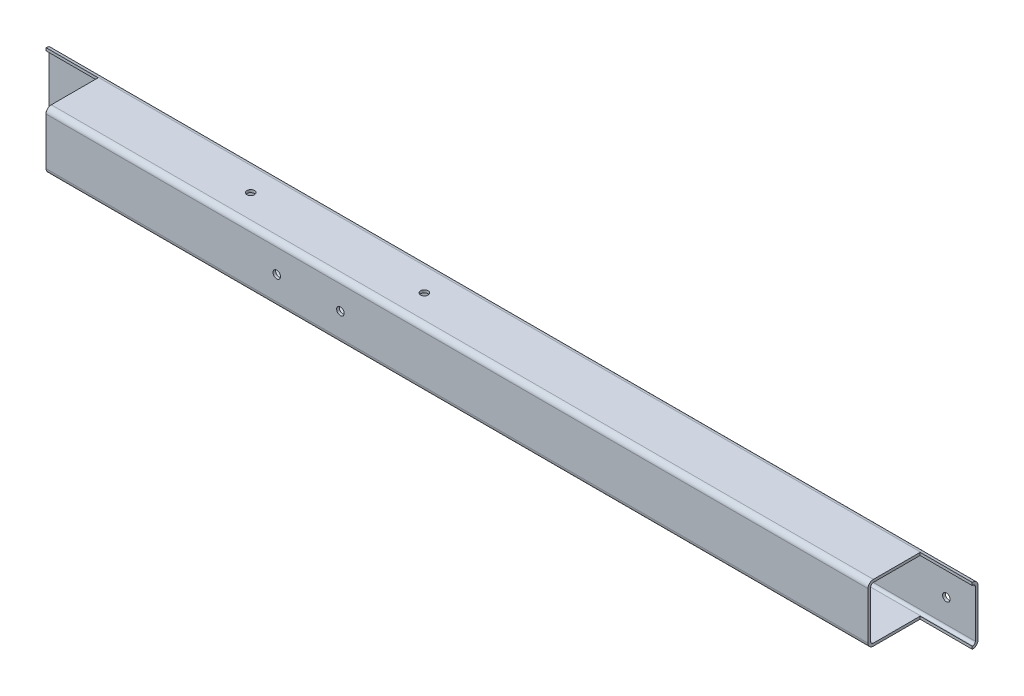
ISO-10303-21;
HEADER;
FILE_DESCRIPTION(('STEP AP214'),'2;1');
FILE_NAME('part.step','',(''),(''),'','','');
FILE_SCHEMA(('AUTOMOTIVE_DESIGN { 1 0 10303 214 1 1 1 1 }'));
ENDSEC;
DATA;
#1=APPLICATION_CONTEXT('core data for automotive mechanical design processes');
#2=APPLICATION_PROTOCOL_DEFINITION('international standard','automotive_design',2000,#1);
#3=PRODUCT_CONTEXT('',#1,'mechanical');
#4=PRODUCT('Part','Part','',(#3));
#5=PRODUCT_RELATED_PRODUCT_CATEGORY('part','',(#4));
#6=PRODUCT_DEFINITION_FORMATION('','',#4);
#7=PRODUCT_DEFINITION_CONTEXT('part definition',#1,'design');
#8=PRODUCT_DEFINITION('design','',#6,#7);
#9=PRODUCT_DEFINITION_SHAPE('','',#8);
#10=(LENGTH_UNIT() NAMED_UNIT(*) SI_UNIT(.MILLI.,.METRE.));
#11=(NAMED_UNIT(*) PLANE_ANGLE_UNIT() SI_UNIT($,.RADIAN.));
#12=(NAMED_UNIT(*) SI_UNIT($,.STERADIAN.) SOLID_ANGLE_UNIT());
#13=UNCERTAINTY_MEASURE_WITH_UNIT(LENGTH_MEASURE(1.E-05),#10,'distance_accuracy_value','');
#14=(GEOMETRIC_REPRESENTATION_CONTEXT(3) GLOBAL_UNCERTAINTY_ASSIGNED_CONTEXT((#13)) GLOBAL_UNIT_ASSIGNED_CONTEXT((#10,
#11,#12)) REPRESENTATION_CONTEXT('',''));
#15=CARTESIAN_POINT('',(0.,0.,0.));
#16=DIRECTION('',(0.,0.,1.));
#17=DIRECTION('',(1.,0.,0.));
#18=AXIS2_PLACEMENT_3D('',#15,#16,#17);
#19=CARTESIAN_POINT('',(400.,-20.3999999999999,20.4));
#20=DIRECTION('',(-1.,0.,0.));
#21=DIRECTION('',(0.,-1.,0.));
#22=AXIS2_PLACEMENT_3D('',#19,#20,#21);
#23=CYLINDRICAL_SURFACE('',#22,2.3);
#24=CARTESIAN_POINT('',(-355.,-20.4,20.4));
#25=DIRECTION('',(1.,0.,0.));
#26=DIRECTION('',(0.,0.,-1.));
#27=AXIS2_PLACEMENT_3D('',#24,#25,#26);
#28=CIRCLE('',#27,2.3);
#29=CARTESIAN_POINT('',(-355.,-20.3999999999999,22.7));
#30=VERTEX_POINT('',#29);
#31=CARTESIAN_POINT('',(-355.,-22.7,20.4));
#32=VERTEX_POINT('',#31);
#33=EDGE_CURVE('E332',#30,#32,#28,.T.);
#34=ORIENTED_EDGE('',*,*,#33,.F.);
#35=DIRECTION('',(-1.,0.,0.));
#36=VECTOR('',#35,1.);
#37=CARTESIAN_POINT('',(400.,-20.3999999999999,22.7));
#38=LINE('',#37,#36);
#39=CARTESIAN_POINT('',(355.,-20.3999999999999,22.7));
#40=VERTEX_POINT('',#39);
#41=EDGE_CURVE('E444',#40,#30,#38,.T.);
#42=ORIENTED_EDGE('',*,*,#41,.F.);
#43=CARTESIAN_POINT('',(355.,-20.3999999999999,20.4));
#44=DIRECTION('',(-1.,0.,0.));
#45=DIRECTION('',(0.,0.,1.));
#46=AXIS2_PLACEMENT_3D('',#43,#44,#45);
#47=CIRCLE('',#46,2.3);
#48=CARTESIAN_POINT('',(355.,-22.6999999999999,20.4));
#49=VERTEX_POINT('',#48);
#50=EDGE_CURVE('E312',#49,#40,#47,.T.);
#51=ORIENTED_EDGE('',*,*,#50,.F.);
#52=DIRECTION('',(-1.,0.,0.));
#53=VECTOR('',#52,1.);
#54=CARTESIAN_POINT('',(400.,-22.6999999999999,20.4));
#55=LINE('',#54,#53);
#56=EDGE_CURVE('E418',#49,#32,#55,.T.);
#57=ORIENTED_EDGE('',*,*,#56,.T.);
#58=EDGE_LOOP('',(#34,#42,#51,#57));
#59=FACE_BOUND('',#58,.T.);
#60=ADVANCED_FACE('F65',(#59),#23,.F.);
#61=CARTESIAN_POINT('',(400.,-20.3999999999999,22.7));
#62=DIRECTION('',(0.,0.,-1.));
#63=DIRECTION('',(-1.,0.,0.));
#64=AXIS2_PLACEMENT_3D('',#61,#62,#63);
#65=PLANE('',#64);
#66=CARTESIAN_POINT('',(-155.7,0.,22.7));
#67=DIRECTION('',(0.,0.,-1.));
#68=DIRECTION('',(-1.,0.,0.));
#69=AXIS2_PLACEMENT_3D('',#66,#67,#68);
#70=CIRCLE('',#69,3.25000000000001);
#71=CARTESIAN_POINT('',(-158.95,0.,22.7));
#72=VERTEX_POINT('',#71);
#73=EDGE_CURVE('E544',#72,#72,#70,.T.);
#74=ORIENTED_EDGE('',*,*,#73,.F.);
#75=EDGE_LOOP('',(#74));
#76=FACE_BOUND('',#75,.T.);
#77=CARTESIAN_POINT('',(-100.7,0.,22.7));
#78=DIRECTION('',(0.,0.,-1.));
#79=DIRECTION('',(-1.,0.,0.));
#80=AXIS2_PLACEMENT_3D('',#77,#78,#79);
#81=CIRCLE('',#80,3.25000000000001);
#82=CARTESIAN_POINT('',(-103.95,0.,22.7));
#83=VERTEX_POINT('',#82);
#84=EDGE_CURVE('E536',#83,#83,#81,.T.);
#85=ORIENTED_EDGE('',*,*,#84,.F.);
#86=EDGE_LOOP('',(#85));
#87=FACE_BOUND('',#86,.T.);
#88=DIRECTION('',(0.,-1.,0.));
#89=VECTOR('',#88,1.);
#90=CARTESIAN_POINT('',(-355.,-20.3999999999999,22.7));
#91=LINE('',#90,#89);
#92=CARTESIAN_POINT('',(-355.,20.4000000000001,22.7));
#93=VERTEX_POINT('',#92);
#94=EDGE_CURVE('E335',#93,#30,#91,.T.);
#95=ORIENTED_EDGE('',*,*,#94,.F.);
#96=DIRECTION('',(-1.,0.,0.));
#97=VECTOR('',#96,1.);
#98=CARTESIAN_POINT('',(400.,20.4000000000001,22.7));
#99=LINE('',#98,#97);
#100=CARTESIAN_POINT('',(355.,20.4000000000001,22.7));
#101=VERTEX_POINT('',#100);
#102=EDGE_CURVE('E440',#101,#93,#99,.T.);
#103=ORIENTED_EDGE('',*,*,#102,.F.);
#104=DIRECTION('',(0.,1.,0.));
#105=VECTOR('',#104,1.);
#106=CARTESIAN_POINT('',(355.,-20.3999999999999,22.7));
#107=LINE('',#106,#105);
#108=EDGE_CURVE('E315',#40,#101,#107,.T.);
#109=ORIENTED_EDGE('',*,*,#108,.F.);
#110=ORIENTED_EDGE('',*,*,#41,.T.);
#111=EDGE_LOOP('',(#95,#103,#109,#110));
#112=FACE_BOUND('',#111,.T.);
#113=ADVANCED_FACE('F604',(#76,#87,#112),#65,.T.);
#114=CARTESIAN_POINT('',(400.,20.4000000000001,20.4));
#115=DIRECTION('',(-1.,0.,0.));
#116=DIRECTION('',(0.,-1.,0.));
#117=AXIS2_PLACEMENT_3D('',#114,#115,#116);
#118=CYLINDRICAL_SURFACE('',#117,2.3);
#119=CARTESIAN_POINT('',(-355.,20.4,20.4));
#120=DIRECTION('',(1.,0.,0.));
#121=DIRECTION('',(0.,0.,-1.));
#122=AXIS2_PLACEMENT_3D('',#119,#120,#121);
#123=CIRCLE('',#122,2.3);
#124=CARTESIAN_POINT('',(-355.,22.7,20.4));
#125=VERTEX_POINT('',#124);
#126=EDGE_CURVE('E338',#125,#93,#123,.T.);
#127=ORIENTED_EDGE('',*,*,#126,.F.);
#128=DIRECTION('',(-1.,0.,0.));
#129=VECTOR('',#128,1.);
#130=CARTESIAN_POINT('',(400.,22.7000000000001,20.4));
#131=LINE('',#130,#129);
#132=CARTESIAN_POINT('',(355.,22.7000000000001,20.4));
#133=VERTEX_POINT('',#132);
#134=EDGE_CURVE('E436',#133,#125,#131,.T.);
#135=ORIENTED_EDGE('',*,*,#134,.F.);
#136=CARTESIAN_POINT('',(355.,20.4000000000001,20.4));
#137=DIRECTION('',(-1.,0.,0.));
#138=DIRECTION('',(0.,0.,1.));
#139=AXIS2_PLACEMENT_3D('',#136,#137,#138);
#140=CIRCLE('',#139,2.3);
#141=EDGE_CURVE('E318',#101,#133,#140,.T.);
#142=ORIENTED_EDGE('',*,*,#141,.F.);
#143=ORIENTED_EDGE('',*,*,#102,.T.);
#144=EDGE_LOOP('',(#127,#135,#142,#143));
#145=FACE_BOUND('',#144,.T.);
#146=ADVANCED_FACE('F599',(#145),#118,.F.);
#147=CARTESIAN_POINT('',(400.,22.7000000000001,-20.4));
#148=DIRECTION('',(0.,-1.,0.));
#149=DIRECTION('',(1.,0.,0.));
#150=AXIS2_PLACEMENT_3D('',#147,#148,#149);
#151=PLANE('',#150);
#152=CARTESIAN_POINT('',(-203.2,22.7,0.));
#153=DIRECTION('',(0.,-1.,0.));
#154=DIRECTION('',(1.,0.,0.));
#155=AXIS2_PLACEMENT_3D('',#152,#153,#154);
#156=CIRCLE('',#155,3.25000000000001);
#157=CARTESIAN_POINT('',(-199.95,22.7,0.));
#158=VERTEX_POINT('',#157);
#159=EDGE_CURVE('E512',#158,#158,#156,.T.);
#160=ORIENTED_EDGE('',*,*,#159,.F.);
#161=EDGE_LOOP('',(#160));
#162=FACE_BOUND('',#161,.T.);
#163=CARTESIAN_POINT('',(-53.2,22.7000000000001,0.));
#164=DIRECTION('',(0.,-1.,0.));
#165=DIRECTION('',(1.,0.,0.));
#166=AXIS2_PLACEMENT_3D('',#163,#164,#165);
#167=CIRCLE('',#166,3.25);
#168=CARTESIAN_POINT('',(-49.95,22.7000000000001,0.));
#169=VERTEX_POINT('',#168);
#170=EDGE_CURVE('E487',#169,#169,#167,.T.);
#171=ORIENTED_EDGE('',*,*,#170,.F.);
#172=EDGE_LOOP('',(#171));
#173=FACE_BOUND('',#172,.T.);
#174=DIRECTION('',(1.,0.,0.));
#175=VECTOR('',#174,1.);
#176=CARTESIAN_POINT('',(400.,22.7000000000001,-20.));
#177=LINE('',#176,#175);
#178=CARTESIAN_POINT('',(-400.,22.7,-20.));
#179=VERTEX_POINT('',#178);
#180=CARTESIAN_POINT('',(-355.,22.7,-20.));
#181=VERTEX_POINT('',#180);
#182=EDGE_CURVE('E235',#179,#181,#177,.T.);
#183=ORIENTED_EDGE('',*,*,#182,.F.);
#184=DIRECTION('',(0.,0.,1.));
#185=VECTOR('',#184,1.);
#186=CARTESIAN_POINT('',(-400.,22.7,-20.4));
#187=LINE('',#186,#185);
#188=CARTESIAN_POINT('',(-400.,22.7,-20.4));
#189=VERTEX_POINT('',#188);
#190=EDGE_CURVE('E400',#189,#179,#187,.T.);
#191=ORIENTED_EDGE('',*,*,#190,.F.);
#192=DIRECTION('',(-1.,0.,0.));
#193=VECTOR('',#192,1.);
#194=CARTESIAN_POINT('',(400.,22.7000000000001,-20.4));
#195=LINE('',#194,#193);
#196=CARTESIAN_POINT('',(400.,22.7000000000001,-20.4));
#197=VERTEX_POINT('',#196);
#198=EDGE_CURVE('E433',#197,#189,#195,.T.);
#199=ORIENTED_EDGE('',*,*,#198,.F.);
#200=DIRECTION('',(0.,0.,1.));
#201=VECTOR('',#200,1.);
#202=CARTESIAN_POINT('',(400.,22.7000000000001,-20.4));
#203=LINE('',#202,#201);
#204=CARTESIAN_POINT('',(400.,22.7000000000001,-20.));
#205=VERTEX_POINT('',#204);
#206=EDGE_CURVE('E367',#197,#205,#203,.T.);
#207=ORIENTED_EDGE('',*,*,#206,.T.);
#208=DIRECTION('',(1.,0.,0.));
#209=VECTOR('',#208,1.);
#210=CARTESIAN_POINT('',(400.,22.7000000000001,-20.));
#211=LINE('',#210,#209);
#212=CARTESIAN_POINT('',(355.,22.7000000000001,-20.));
#213=VERTEX_POINT('',#212);
#214=EDGE_CURVE('E309',#213,#205,#211,.T.);
#215=ORIENTED_EDGE('',*,*,#214,.F.);
#216=DIRECTION('',(0.,0.,-1.));
#217=VECTOR('',#216,1.);
#218=CARTESIAN_POINT('',(355.,22.7000000000001,-20.4));
#219=LINE('',#218,#217);
#220=EDGE_CURVE('E321',#133,#213,#219,.T.);
#221=ORIENTED_EDGE('',*,*,#220,.F.);
#222=ORIENTED_EDGE('',*,*,#134,.T.);
#223=DIRECTION('',(0.,0.,1.));
#224=VECTOR('',#223,1.);
#225=CARTESIAN_POINT('',(-355.,22.7,-20.4));
#226=LINE('',#225,#224);
#227=EDGE_CURVE('E341',#181,#125,#226,.T.);
#228=ORIENTED_EDGE('',*,*,#227,.F.);
#229=EDGE_LOOP('',(#183,#191,#199,#207,#215,#221,#222,#228));
#230=FACE_BOUND('',#229,.T.);
#231=ADVANCED_FACE('F593',(#162,#173,#230),#151,.T.);
#232=CARTESIAN_POINT('',(400.,20.4000000000001,-20.4));
#233=DIRECTION('',(-1.,0.,0.));
#234=DIRECTION('',(0.,-1.,0.));
#235=AXIS2_PLACEMENT_3D('',#232,#233,#234);
#236=CYLINDRICAL_SURFACE('',#235,2.3);
#237=CARTESIAN_POINT('',(-400.,20.4,-20.4));
#238=DIRECTION('',(1.,0.,0.));
#239=DIRECTION('',(0.,1.,0.));
#240=AXIS2_PLACEMENT_3D('',#237,#238,#239);
#241=CIRCLE('',#240,2.3);
#242=CARTESIAN_POINT('',(-400.,20.4,-22.7));
#243=VERTEX_POINT('',#242);
#244=EDGE_CURVE('E404',#243,#189,#241,.T.);
#245=ORIENTED_EDGE('',*,*,#244,.F.);
#246=DIRECTION('',(-1.,0.,0.));
#247=VECTOR('',#246,1.);
#248=CARTESIAN_POINT('',(400.,20.4000000000001,-22.7));
#249=LINE('',#248,#247);
#250=CARTESIAN_POINT('',(400.,20.4000000000001,-22.7));
#251=VERTEX_POINT('',#250);
#252=EDGE_CURVE('E430',#251,#243,#249,.T.);
#253=ORIENTED_EDGE('',*,*,#252,.F.);
#254=CARTESIAN_POINT('',(400.,20.4000000000001,-20.4));
#255=DIRECTION('',(1.,0.,0.));
#256=DIRECTION('',(0.,1.,0.));
#257=AXIS2_PLACEMENT_3D('',#254,#255,#256);
#258=CIRCLE('',#257,2.3);
#259=EDGE_CURVE('E371',#251,#197,#258,.T.);
#260=ORIENTED_EDGE('',*,*,#259,.T.);
#261=ORIENTED_EDGE('',*,*,#198,.T.);
#262=EDGE_LOOP('',(#245,#253,#260,#261));
#263=FACE_BOUND('',#262,.T.);
#264=ADVANCED_FACE('F570',(#263),#236,.F.);
#265=CARTESIAN_POINT('',(400.,-20.3999999999999,-22.7));
#266=DIRECTION('',(0.,0.,1.));
#267=DIRECTION('',(1.,0.,0.));
#268=AXIS2_PLACEMENT_3D('',#265,#266,#267);
#269=PLANE('',#268);
#270=CARTESIAN_POINT('',(-155.7,0.,-22.7));
#271=DIRECTION('',(0.,0.,1.));
#272=DIRECTION('',(1.,0.,0.));
#273=AXIS2_PLACEMENT_3D('',#270,#271,#272);
#274=CIRCLE('',#273,3.25000000000001);
#275=CARTESIAN_POINT('',(-152.45,0.,-22.7));
#276=VERTEX_POINT('',#275);
#277=EDGE_CURVE('E540',#276,#276,#274,.T.);
#278=ORIENTED_EDGE('',*,*,#277,.F.);
#279=EDGE_LOOP('',(#278));
#280=FACE_BOUND('',#279,.T.);
#281=CARTESIAN_POINT('',(-100.7,0.,-22.7));
#282=DIRECTION('',(0.,0.,1.));
#283=DIRECTION('',(1.,0.,0.));
#284=AXIS2_PLACEMENT_3D('',#281,#282,#283);
#285=CIRCLE('',#284,3.25000000000001);
#286=CARTESIAN_POINT('',(-97.45,0.,-22.7));
#287=VERTEX_POINT('',#286);
#288=EDGE_CURVE('E521',#287,#287,#285,.T.);
#289=ORIENTED_EDGE('',*,*,#288,.F.);
#290=EDGE_LOOP('',(#289));
#291=FACE_BOUND('',#290,.T.);
#292=CARTESIAN_POINT('',(375.,0.,-22.7));
#293=DIRECTION('',(0.,0.,1.));
#294=DIRECTION('',(1.,0.,0.));
#295=AXIS2_PLACEMENT_3D('',#292,#293,#294);
#296=CIRCLE('',#295,3.24999999999995);
#297=CARTESIAN_POINT('',(378.25,0.,-22.7));
#298=VERTEX_POINT('',#297);
#299=EDGE_CURVE('E283',#298,#298,#296,.T.);
#300=ORIENTED_EDGE('',*,*,#299,.F.);
#301=EDGE_LOOP('',(#300));
#302=FACE_BOUND('',#301,.T.);
#303=CARTESIAN_POINT('',(-375.,1.37772764904077E-13,-22.7));
#304=DIRECTION('',(0.,0.,1.));
#305=DIRECTION('',(1.,0.,0.));
#306=AXIS2_PLACEMENT_3D('',#303,#304,#305);
#307=CIRCLE('',#306,3.24999999999995);
#308=CARTESIAN_POINT('',(-371.75,1.37772764904077E-13,-22.7));
#309=VERTEX_POINT('',#308);
#310=EDGE_CURVE('E553',#309,#309,#307,.T.);
#311=ORIENTED_EDGE('',*,*,#310,.F.);
#312=EDGE_LOOP('',(#311));
#313=FACE_BOUND('',#312,.T.);
#314=DIRECTION('',(0.,1.,0.));
#315=VECTOR('',#314,1.);
#316=CARTESIAN_POINT('',(-400.,-20.4,-22.7));
#317=LINE('',#316,#315);
#318=CARTESIAN_POINT('',(-400.,-20.4,-22.7));
#319=VERTEX_POINT('',#318);
#320=EDGE_CURVE('E408',#319,#243,#317,.T.);
#321=ORIENTED_EDGE('',*,*,#320,.F.);
#322=DIRECTION('',(-1.,0.,0.));
#323=VECTOR('',#322,1.);
#324=CARTESIAN_POINT('',(400.,-20.3999999999999,-22.7));
#325=LINE('',#324,#323);
#326=CARTESIAN_POINT('',(400.,-20.3999999999999,-22.7));
#327=VERTEX_POINT('',#326);
#328=EDGE_CURVE('E427',#327,#319,#325,.T.);
#329=ORIENTED_EDGE('',*,*,#328,.F.);
#330=DIRECTION('',(0.,1.,0.));
#331=VECTOR('',#330,1.);
#332=CARTESIAN_POINT('',(400.,-20.3999999999999,-22.7));
#333=LINE('',#332,#331);
#334=EDGE_CURVE('E375',#327,#251,#333,.T.);
#335=ORIENTED_EDGE('',*,*,#334,.T.);
#336=ORIENTED_EDGE('',*,*,#252,.T.);
#337=EDGE_LOOP('',(#321,#329,#335,#336));
#338=FACE_BOUND('',#337,.T.);
#339=ADVANCED_FACE('F566',(#280,#291,#302,#313,#338),#269,.T.);
#340=CARTESIAN_POINT('',(400.,-20.3999999999999,-20.4));
#341=DIRECTION('',(-1.,0.,0.));
#342=DIRECTION('',(0.,-1.,0.));
#343=AXIS2_PLACEMENT_3D('',#340,#341,#342);
#344=CYLINDRICAL_SURFACE('',#343,2.3);
#345=CARTESIAN_POINT('',(-400.,-20.4,-20.4));
#346=DIRECTION('',(1.,0.,0.));
#347=DIRECTION('',(0.,-1.,0.));
#348=AXIS2_PLACEMENT_3D('',#345,#346,#347);
#349=CIRCLE('',#348,2.3);
#350=CARTESIAN_POINT('',(-400.,-22.7,-20.4));
#351=VERTEX_POINT('',#350);
#352=EDGE_CURVE('E412',#351,#319,#349,.T.);
#353=ORIENTED_EDGE('',*,*,#352,.F.);
#354=DIRECTION('',(-1.,0.,0.));
#355=VECTOR('',#354,1.);
#356=CARTESIAN_POINT('',(400.,-22.6999999999999,-20.4));
#357=LINE('',#356,#355);
#358=CARTESIAN_POINT('',(400.,-22.6999999999999,-20.4));
#359=VERTEX_POINT('',#358);
#360=EDGE_CURVE('E422',#359,#351,#357,.T.);
#361=ORIENTED_EDGE('',*,*,#360,.F.);
#362=CARTESIAN_POINT('',(400.,-20.3999999999999,-20.4));
#363=DIRECTION('',(1.,0.,0.));
#364=DIRECTION('',(0.,-1.,0.));
#365=AXIS2_PLACEMENT_3D('',#362,#363,#364);
#366=CIRCLE('',#365,2.3);
#367=EDGE_CURVE('E379',#359,#327,#366,.T.);
#368=ORIENTED_EDGE('',*,*,#367,.T.);
#369=ORIENTED_EDGE('',*,*,#328,.T.);
#370=EDGE_LOOP('',(#353,#361,#368,#369));
#371=FACE_BOUND('',#370,.T.);
#372=ADVANCED_FACE('F569',(#371),#344,.F.);
#373=CARTESIAN_POINT('',(400.,-20.3999999999999,20.4));
#374=DIRECTION('',(-1.,0.,0.));
#375=DIRECTION('',(0.,-1.,0.));
#376=AXIS2_PLACEMENT_3D('',#373,#374,#375);
#377=CYLINDRICAL_SURFACE('',#376,4.6);
#378=DIRECTION('',(-1.,0.,0.));
#379=VECTOR('',#378,1.);
#380=CARTESIAN_POINT('',(400.,-20.3999999999999,25.));
#381=LINE('',#380,#379);
#382=CARTESIAN_POINT('',(355.,-20.4,25.));
#383=VERTEX_POINT('',#382);
#384=CARTESIAN_POINT('',(-355.,-20.4,25.));
#385=VERTEX_POINT('',#384);
#386=EDGE_CURVE('E386',#383,#385,#381,.T.);
#387=ORIENTED_EDGE('',*,*,#386,.T.);
#388=CARTESIAN_POINT('',(-355.,-20.4,20.4));
#389=DIRECTION('',(1.,0.,0.));
#390=DIRECTION('',(0.,0.,-1.));
#391=AXIS2_PLACEMENT_3D('',#388,#389,#390);
#392=CIRCLE('',#391,4.6);
#393=CARTESIAN_POINT('',(-355.,-25.,20.4));
#394=VERTEX_POINT('',#393);
#395=EDGE_CURVE('E346',#385,#394,#392,.T.);
#396=ORIENTED_EDGE('',*,*,#395,.T.);
#397=DIRECTION('',(-1.,0.,0.));
#398=VECTOR('',#397,1.);
#399=CARTESIAN_POINT('',(400.,-24.9999999999999,20.4));
#400=LINE('',#399,#398);
#401=CARTESIAN_POINT('',(355.,-25.,20.4));
#402=VERTEX_POINT('',#401);
#403=EDGE_CURVE('E423',#402,#394,#400,.T.);
#404=ORIENTED_EDGE('',*,*,#403,.F.);
#405=CARTESIAN_POINT('',(355.,-20.3999999999999,20.4));
#406=DIRECTION('',(-1.,0.,0.));
#407=DIRECTION('',(0.,0.,1.));
#408=AXIS2_PLACEMENT_3D('',#405,#406,#407);
#409=CIRCLE('',#408,4.6);
#410=EDGE_CURVE('E328',#402,#383,#409,.T.);
#411=ORIENTED_EDGE('',*,*,#410,.T.);
#412=EDGE_LOOP('',(#387,#396,#404,#411));
#413=FACE_BOUND('',#412,.T.);
#414=ADVANCED_FACE('F67',(#413),#377,.T.);
#415=CARTESIAN_POINT('',(400.,-24.9999999999999,-20.4));
#416=DIRECTION('',(0.,1.,0.));
#417=DIRECTION('',(-1.,0.,0.));
#418=AXIS2_PLACEMENT_3D('',#415,#416,#417);
#419=PLANE('',#418);
#420=CARTESIAN_POINT('',(-203.2,-25.0000000000001,0.));
#421=DIRECTION('',(0.,1.,0.));
#422=DIRECTION('',(-1.,0.,0.));
#423=AXIS2_PLACEMENT_3D('',#420,#421,#422);
#424=CIRCLE('',#423,3.25000000000001);
#425=CARTESIAN_POINT('',(-206.45,-25.0000000000001,0.));
#426=VERTEX_POINT('',#425);
#427=EDGE_CURVE('E488',#426,#426,#424,.T.);
#428=ORIENTED_EDGE('',*,*,#427,.T.);
#429=EDGE_LOOP('',(#428));
#430=FACE_BOUND('',#429,.T.);
#431=CARTESIAN_POINT('',(-53.2,-25.0000000000001,0.));
#432=DIRECTION('',(0.,1.,0.));
#433=DIRECTION('',(-1.,0.,0.));
#434=AXIS2_PLACEMENT_3D('',#431,#432,#433);
#435=CIRCLE('',#434,3.25);
#436=CARTESIAN_POINT('',(-56.45,-25.0000000000001,0.));
#437=VERTEX_POINT('',#436);
#438=EDGE_CURVE('E502',#437,#437,#435,.T.);
#439=ORIENTED_EDGE('',*,*,#438,.T.);
#440=EDGE_LOOP('',(#439));
#441=FACE_BOUND('',#440,.T.);
#442=DIRECTION('',(0.,0.,-1.));
#443=VECTOR('',#442,1.);
#444=CARTESIAN_POINT('',(-355.,-25.,25.));
#445=LINE('',#444,#443);
#446=CARTESIAN_POINT('',(-355.,-25.,-20.));
#447=VERTEX_POINT('',#446);
#448=EDGE_CURVE('E259',#394,#447,#445,.T.);
#449=ORIENTED_EDGE('',*,*,#448,.T.);
#450=DIRECTION('',(-1.,0.,0.));
#451=VECTOR('',#450,1.);
#452=CARTESIAN_POINT('',(-400.,-25.,-20.));
#453=LINE('',#452,#451);
#454=CARTESIAN_POINT('',(-400.,-25.,-20.));
#455=VERTEX_POINT('',#454);
#456=EDGE_CURVE('E265',#447,#455,#453,.T.);
#457=ORIENTED_EDGE('',*,*,#456,.T.);
#458=DIRECTION('',(0.,0.,-1.));
#459=VECTOR('',#458,1.);
#460=CARTESIAN_POINT('',(-400.,-25.,-20.4));
#461=LINE('',#460,#459);
#462=CARTESIAN_POINT('',(-400.,-25.,-20.4));
#463=VERTEX_POINT('',#462);
#464=EDGE_CURVE('E350',#455,#463,#461,.T.);
#465=ORIENTED_EDGE('',*,*,#464,.T.);
#466=DIRECTION('',(-1.,0.,0.));
#467=VECTOR('',#466,1.);
#468=CARTESIAN_POINT('',(400.,-24.9999999999999,-20.4));
#469=LINE('',#468,#467);
#470=CARTESIAN_POINT('',(400.,-24.9999999999999,-20.4));
#471=VERTEX_POINT('',#470);
#472=EDGE_CURVE('E470',#471,#463,#469,.T.);
#473=ORIENTED_EDGE('',*,*,#472,.F.);
#474=DIRECTION('',(0.,0.,-1.));
#475=VECTOR('',#474,1.);
#476=CARTESIAN_POINT('',(400.,-24.9999999999999,-20.4));
#477=LINE('',#476,#475);
#478=CARTESIAN_POINT('',(400.,-24.9999999999999,-20.));
#479=VERTEX_POINT('',#478);
#480=EDGE_CURVE('E351',#479,#471,#477,.T.);
#481=ORIENTED_EDGE('',*,*,#480,.F.);
#482=DIRECTION('',(-1.,0.,0.));
#483=VECTOR('',#482,1.);
#484=CARTESIAN_POINT('',(400.,-25.,-20.));
#485=LINE('',#484,#483);
#486=CARTESIAN_POINT('',(355.,-25.,-20.));
#487=VERTEX_POINT('',#486);
#488=EDGE_CURVE('E83',#479,#487,#485,.T.);
#489=ORIENTED_EDGE('',*,*,#488,.T.);
#490=DIRECTION('',(0.,0.,1.));
#491=VECTOR('',#490,1.);
#492=CARTESIAN_POINT('',(355.,-25.,25.));
#493=LINE('',#492,#491);
#494=EDGE_CURVE('E288',#487,#402,#493,.T.);
#495=ORIENTED_EDGE('',*,*,#494,.T.);
#496=ORIENTED_EDGE('',*,*,#403,.T.);
#497=EDGE_LOOP('',(#449,#457,#465,#473,#481,#489,#495,#496));
#498=FACE_BOUND('',#497,.T.);
#499=ADVANCED_FACE('F619',(#430,#441,#498),#419,.F.);
#500=CARTESIAN_POINT('',(400.,-20.3999999999999,-20.4));
#501=DIRECTION('',(-1.,0.,0.));
#502=DIRECTION('',(0.,-1.,0.));
#503=AXIS2_PLACEMENT_3D('',#500,#501,#502);
#504=CYLINDRICAL_SURFACE('',#503,4.6);
#505=CARTESIAN_POINT('',(-400.,-20.4,-20.4));
#506=DIRECTION('',(1.,0.,0.));
#507=DIRECTION('',(0.,-1.,0.));
#508=AXIS2_PLACEMENT_3D('',#505,#506,#507);
#509=CIRCLE('',#508,4.6);
#510=CARTESIAN_POINT('',(-400.,-20.4,-25.));
#511=VERTEX_POINT('',#510);
#512=EDGE_CURVE('E389',#463,#511,#509,.T.);
#513=ORIENTED_EDGE('',*,*,#512,.T.);
#514=DIRECTION('',(-1.,0.,0.));
#515=VECTOR('',#514,1.);
#516=CARTESIAN_POINT('',(400.,-20.3999999999999,-25.));
#517=LINE('',#516,#515);
#518=CARTESIAN_POINT('',(400.,-20.3999999999999,-25.));
#519=VERTEX_POINT('',#518);
#520=EDGE_CURVE('E466',#519,#511,#517,.T.);
#521=ORIENTED_EDGE('',*,*,#520,.F.);
#522=CARTESIAN_POINT('',(400.,-20.3999999999999,-20.4));
#523=DIRECTION('',(1.,0.,0.));
#524=DIRECTION('',(0.,-1.,0.));
#525=AXIS2_PLACEMENT_3D('',#522,#523,#524);
#526=CIRCLE('',#525,4.6);
#527=EDGE_CURVE('E353',#471,#519,#526,.T.);
#528=ORIENTED_EDGE('',*,*,#527,.F.);
#529=ORIENTED_EDGE('',*,*,#472,.T.);
#530=EDGE_LOOP('',(#513,#521,#528,#529));
#531=FACE_BOUND('',#530,.T.);
#532=ADVANCED_FACE('F654',(#531),#504,.T.);
#533=CARTESIAN_POINT('',(400.,-20.3999999999999,-25.));
#534=DIRECTION('',(0.,0.,1.));
#535=DIRECTION('',(1.,0.,0.));
#536=AXIS2_PLACEMENT_3D('',#533,#534,#535);
#537=PLANE('',#536);
#538=CARTESIAN_POINT('',(-155.7,0.,-25.));
#539=DIRECTION('',(0.,0.,1.));
#540=DIRECTION('',(1.,0.,0.));
#541=AXIS2_PLACEMENT_3D('',#538,#539,#540);
#542=CIRCLE('',#541,3.25000000000001);
#543=CARTESIAN_POINT('',(-152.45,0.,-25.));
#544=VERTEX_POINT('',#543);
#545=EDGE_CURVE('E517',#544,#544,#542,.T.);
#546=ORIENTED_EDGE('',*,*,#545,.T.);
#547=EDGE_LOOP('',(#546));
#548=FACE_BOUND('',#547,.T.);
#549=CARTESIAN_POINT('',(-100.7,0.,-25.));
#550=DIRECTION('',(0.,0.,1.));
#551=DIRECTION('',(1.,0.,0.));
#552=AXIS2_PLACEMENT_3D('',#549,#550,#551);
#553=CIRCLE('',#552,3.25000000000001);
#554=CARTESIAN_POINT('',(-97.45,0.,-25.));
#555=VERTEX_POINT('',#554);
#556=EDGE_CURVE('E526',#555,#555,#553,.T.);
#557=ORIENTED_EDGE('',*,*,#556,.T.);
#558=EDGE_LOOP('',(#557));
#559=FACE_BOUND('',#558,.T.);
#560=CARTESIAN_POINT('',(375.,0.,-25.));
#561=DIRECTION('',(0.,0.,-1.));
#562=DIRECTION('',(-1.,0.,0.));
#563=AXIS2_PLACEMENT_3D('',#560,#561,#562);
#564=CIRCLE('',#563,3.24999999999995);
#565=CARTESIAN_POINT('',(371.75,0.,-25.));
#566=VERTEX_POINT('',#565);
#567=EDGE_CURVE('E549',#566,#566,#564,.T.);
#568=ORIENTED_EDGE('',*,*,#567,.F.);
#569=EDGE_LOOP('',(#568));
#570=FACE_BOUND('',#569,.T.);
#571=CARTESIAN_POINT('',(-375.,1.37772764904077E-13,-25.));
#572=DIRECTION('',(0.,0.,-1.));
#573=DIRECTION('',(-1.,0.,0.));
#574=AXIS2_PLACEMENT_3D('',#571,#572,#573);
#575=CIRCLE('',#574,3.24999999999995);
#576=CARTESIAN_POINT('',(-378.25,1.37772764904077E-13,-25.));
#577=VERTEX_POINT('',#576);
#578=EDGE_CURVE('E548',#577,#577,#575,.T.);
#579=ORIENTED_EDGE('',*,*,#578,.F.);
#580=EDGE_LOOP('',(#579));
#581=FACE_BOUND('',#580,.T.);
#582=DIRECTION('',(0.,1.,0.));
#583=VECTOR('',#582,1.);
#584=CARTESIAN_POINT('',(-400.,-20.4,-25.));
#585=LINE('',#584,#583);
#586=CARTESIAN_POINT('',(-400.,20.4,-25.));
#587=VERTEX_POINT('',#586);
#588=EDGE_CURVE('E392',#511,#587,#585,.T.);
#589=ORIENTED_EDGE('',*,*,#588,.T.);
#590=DIRECTION('',(-1.,0.,0.));
#591=VECTOR('',#590,1.);
#592=CARTESIAN_POINT('',(400.,20.4000000000001,-25.));
#593=LINE('',#592,#591);
#594=CARTESIAN_POINT('',(400.,20.4000000000001,-25.));
#595=VERTEX_POINT('',#594);
#596=EDGE_CURVE('E462',#595,#587,#593,.T.);
#597=ORIENTED_EDGE('',*,*,#596,.F.);
#598=DIRECTION('',(0.,1.,0.));
#599=VECTOR('',#598,1.);
#600=CARTESIAN_POINT('',(400.,-20.3999999999999,-25.));
#601=LINE('',#600,#599);
#602=EDGE_CURVE('E357',#519,#595,#601,.T.);
#603=ORIENTED_EDGE('',*,*,#602,.F.);
#604=ORIENTED_EDGE('',*,*,#520,.T.);
#605=EDGE_LOOP('',(#589,#597,#603,#604));
#606=FACE_BOUND('',#605,.T.);
#607=ADVANCED_FACE('F650',(#548,#559,#570,#581,#606),#537,.F.);
#608=CARTESIAN_POINT('',(400.,20.4000000000001,-20.4));
#609=DIRECTION('',(-1.,0.,0.));
#610=DIRECTION('',(0.,-1.,0.));
#611=AXIS2_PLACEMENT_3D('',#608,#609,#610);
#612=CYLINDRICAL_SURFACE('',#611,4.6);
#613=CARTESIAN_POINT('',(-400.,20.4,-20.4));
#614=DIRECTION('',(1.,0.,0.));
#615=DIRECTION('',(0.,1.,0.));
#616=AXIS2_PLACEMENT_3D('',#613,#614,#615);
#617=CIRCLE('',#616,4.6);
#618=CARTESIAN_POINT('',(-400.,25.,-20.4));
#619=VERTEX_POINT('',#618);
#620=EDGE_CURVE('E395',#587,#619,#617,.T.);
#621=ORIENTED_EDGE('',*,*,#620,.T.);
#622=DIRECTION('',(-1.,0.,0.));
#623=VECTOR('',#622,1.);
#624=CARTESIAN_POINT('',(400.,25.0000000000001,-20.4));
#625=LINE('',#624,#623);
#626=CARTESIAN_POINT('',(400.,25.0000000000001,-20.4));
#627=VERTEX_POINT('',#626);
#628=EDGE_CURVE('E459',#627,#619,#625,.T.);
#629=ORIENTED_EDGE('',*,*,#628,.F.);
#630=CARTESIAN_POINT('',(400.,20.4000000000001,-20.4));
#631=DIRECTION('',(1.,0.,0.));
#632=DIRECTION('',(0.,1.,0.));
#633=AXIS2_PLACEMENT_3D('',#630,#631,#632);
#634=CIRCLE('',#633,4.6);
#635=EDGE_CURVE('E360',#595,#627,#634,.T.);
#636=ORIENTED_EDGE('',*,*,#635,.F.);
#637=ORIENTED_EDGE('',*,*,#596,.T.);
#638=EDGE_LOOP('',(#621,#629,#636,#637));
#639=FACE_BOUND('',#638,.T.);
#640=ADVANCED_FACE('F646',(#639),#612,.T.);
#641=CARTESIAN_POINT('',(400.,25.0000000000001,-20.4));
#642=DIRECTION('',(0.,-1.,0.));
#643=DIRECTION('',(1.,0.,0.));
#644=AXIS2_PLACEMENT_3D('',#641,#642,#643);
#645=PLANE('',#644);
#646=CARTESIAN_POINT('',(-203.2,25.,0.));
#647=DIRECTION('',(0.,1.,0.));
#648=DIRECTION('',(-1.,0.,0.));
#649=AXIS2_PLACEMENT_3D('',#646,#647,#648);
#650=CIRCLE('',#649,3.25000000000001);
#651=CARTESIAN_POINT('',(-206.45,25.,0.));
#652=VERTEX_POINT('',#651);
#653=EDGE_CURVE('E496',#652,#652,#650,.T.);
#654=ORIENTED_EDGE('',*,*,#653,.F.);
#655=EDGE_LOOP('',(#654));
#656=FACE_BOUND('',#655,.T.);
#657=CARTESIAN_POINT('',(-53.2,25.0000000000001,0.));
#658=DIRECTION('',(0.,1.,0.));
#659=DIRECTION('',(-1.,0.,0.));
#660=AXIS2_PLACEMENT_3D('',#657,#658,#659);
#661=CIRCLE('',#660,3.25);
#662=CARTESIAN_POINT('',(-56.45,25.0000000000001,0.));
#663=VERTEX_POINT('',#662);
#664=EDGE_CURVE('E508',#663,#663,#661,.T.);
#665=ORIENTED_EDGE('',*,*,#664,.F.);
#666=EDGE_LOOP('',(#665));
#667=FACE_BOUND('',#666,.T.);
#668=DIRECTION('',(0.,0.,1.));
#669=VECTOR('',#668,1.);
#670=CARTESIAN_POINT('',(-400.,25.,-20.4));
#671=LINE('',#670,#669);
#672=CARTESIAN_POINT('',(-400.,25.0000000000001,-20.));
#673=VERTEX_POINT('',#672);
#674=EDGE_CURVE('E257',#619,#673,#671,.T.);
#675=ORIENTED_EDGE('',*,*,#674,.T.);
#676=DIRECTION('',(-1.,0.,0.));
#677=VECTOR('',#676,1.);
#678=CARTESIAN_POINT('',(-400.,25.0000000000001,-20.));
#679=LINE('',#678,#677);
#680=CARTESIAN_POINT('',(-355.,25.0000000000001,-20.));
#681=VERTEX_POINT('',#680);
#682=EDGE_CURVE('E232',#681,#673,#679,.T.);
#683=ORIENTED_EDGE('',*,*,#682,.F.);
#684=DIRECTION('',(0.,0.,-1.));
#685=VECTOR('',#684,1.);
#686=CARTESIAN_POINT('',(-355.,25.0000000000001,25.));
#687=LINE('',#686,#685);
#688=CARTESIAN_POINT('',(-355.,25.0000000000001,20.4));
#689=VERTEX_POINT('',#688);
#690=EDGE_CURVE('E243',#689,#681,#687,.T.);
#691=ORIENTED_EDGE('',*,*,#690,.F.);
#692=DIRECTION('',(-1.,0.,0.));
#693=VECTOR('',#692,1.);
#694=CARTESIAN_POINT('',(400.,25.0000000000001,20.4));
#695=LINE('',#694,#693);
#696=CARTESIAN_POINT('',(355.,25.0000000000001,20.4));
#697=VERTEX_POINT('',#696);
#698=EDGE_CURVE('E456',#697,#689,#695,.T.);
#699=ORIENTED_EDGE('',*,*,#698,.F.);
#700=DIRECTION('',(0.,0.,1.));
#701=VECTOR('',#700,1.);
#702=CARTESIAN_POINT('',(355.,25.0000000000001,25.));
#703=LINE('',#702,#701);
#704=CARTESIAN_POINT('',(355.,25.0000000000001,-20.));
#705=VERTEX_POINT('',#704);
#706=EDGE_CURVE('E282',#705,#697,#703,.T.);
#707=ORIENTED_EDGE('',*,*,#706,.F.);
#708=DIRECTION('',(-1.,0.,0.));
#709=VECTOR('',#708,1.);
#710=CARTESIAN_POINT('',(400.,25.0000000000001,-20.));
#711=LINE('',#710,#709);
#712=CARTESIAN_POINT('',(400.,25.0000000000001,-20.));
#713=VERTEX_POINT('',#712);
#714=EDGE_CURVE('E278',#713,#705,#711,.T.);
#715=ORIENTED_EDGE('',*,*,#714,.F.);
#716=DIRECTION('',(0.,0.,1.));
#717=VECTOR('',#716,1.);
#718=CARTESIAN_POINT('',(400.,25.0000000000001,-20.4));
#719=LINE('',#718,#717);
#720=EDGE_CURVE('E363',#627,#713,#719,.T.);
#721=ORIENTED_EDGE('',*,*,#720,.F.);
#722=ORIENTED_EDGE('',*,*,#628,.T.);
#723=EDGE_LOOP('',(#675,#683,#691,#699,#707,#715,#721,#722));
#724=FACE_BOUND('',#723,.T.);
#725=ADVANCED_FACE('F254',(#656,#667,#724),#645,.F.);
#726=CARTESIAN_POINT('',(400.,20.4000000000001,20.4));
#727=DIRECTION('',(-1.,0.,0.));
#728=DIRECTION('',(0.,-1.,0.));
#729=AXIS2_PLACEMENT_3D('',#726,#727,#728);
#730=CYLINDRICAL_SURFACE('',#729,4.6);
#731=ORIENTED_EDGE('',*,*,#698,.T.);
#732=CARTESIAN_POINT('',(-355.,20.4,20.4));
#733=DIRECTION('',(1.,0.,0.));
#734=DIRECTION('',(0.,0.,-1.));
#735=AXIS2_PLACEMENT_3D('',#732,#733,#734);
#736=CIRCLE('',#735,4.6);
#737=CARTESIAN_POINT('',(-355.,20.4000000000001,25.));
#738=VERTEX_POINT('',#737);
#739=EDGE_CURVE('E246',#689,#738,#736,.T.);
#740=ORIENTED_EDGE('',*,*,#739,.T.);
#741=DIRECTION('',(-1.,0.,0.));
#742=VECTOR('',#741,1.);
#743=CARTESIAN_POINT('',(400.,20.4000000000001,25.));
#744=LINE('',#743,#742);
#745=CARTESIAN_POINT('',(355.,20.4000000000001,25.));
#746=VERTEX_POINT('',#745);
#747=EDGE_CURVE('E452',#746,#738,#744,.T.);
#748=ORIENTED_EDGE('',*,*,#747,.F.);
#749=CARTESIAN_POINT('',(355.,20.4000000000001,20.4));
#750=DIRECTION('',(-1.,0.,0.));
#751=DIRECTION('',(0.,0.,1.));
#752=AXIS2_PLACEMENT_3D('',#749,#750,#751);
#753=CIRCLE('',#752,4.6);
#754=EDGE_CURVE('E324',#746,#697,#753,.T.);
#755=ORIENTED_EDGE('',*,*,#754,.T.);
#756=EDGE_LOOP('',(#731,#740,#748,#755));
#757=FACE_BOUND('',#756,.T.);
#758=ADVANCED_FACE('F628',(#757),#730,.T.);
#759=CARTESIAN_POINT('',(400.,-20.3999999999999,25.));
#760=DIRECTION('',(0.,0.,-1.));
#761=DIRECTION('',(-1.,0.,0.));
#762=AXIS2_PLACEMENT_3D('',#759,#760,#761);
#763=PLANE('',#762);
#764=CARTESIAN_POINT('',(-155.7,0.,25.));
#765=DIRECTION('',(0.,0.,1.));
#766=DIRECTION('',(1.,0.,0.));
#767=AXIS2_PLACEMENT_3D('',#764,#765,#766);
#768=CIRCLE('',#767,3.25000000000001);
#769=CARTESIAN_POINT('',(-152.45,0.,25.));
#770=VERTEX_POINT('',#769);
#771=EDGE_CURVE('E522',#770,#770,#768,.T.);
#772=ORIENTED_EDGE('',*,*,#771,.F.);
#773=EDGE_LOOP('',(#772));
#774=FACE_BOUND('',#773,.T.);
#775=CARTESIAN_POINT('',(-100.7,0.,25.));
#776=DIRECTION('',(0.,0.,1.));
#777=DIRECTION('',(1.,0.,0.));
#778=AXIS2_PLACEMENT_3D('',#775,#776,#777);
#779=CIRCLE('',#778,3.25000000000001);
#780=CARTESIAN_POINT('',(-97.45,0.,25.));
#781=VERTEX_POINT('',#780);
#782=EDGE_CURVE('E516',#781,#781,#779,.T.);
#783=ORIENTED_EDGE('',*,*,#782,.F.);
#784=EDGE_LOOP('',(#783));
#785=FACE_BOUND('',#784,.T.);
#786=ORIENTED_EDGE('',*,*,#747,.T.);
#787=DIRECTION('',(0.,1.,0.));
#788=VECTOR('',#787,1.);
#789=CARTESIAN_POINT('',(-355.,-25.,25.));
#790=LINE('',#789,#788);
#791=EDGE_CURVE('E240',#385,#738,#790,.T.);
#792=ORIENTED_EDGE('',*,*,#791,.F.);
#793=ORIENTED_EDGE('',*,*,#386,.F.);
#794=DIRECTION('',(0.,1.,0.));
#795=VECTOR('',#794,1.);
#796=CARTESIAN_POINT('',(355.,-25.,25.));
#797=LINE('',#796,#795);
#798=EDGE_CURVE('E251',#383,#746,#797,.T.);
#799=ORIENTED_EDGE('',*,*,#798,.T.);
#800=EDGE_LOOP('',(#786,#792,#793,#799));
#801=FACE_BOUND('',#800,.T.);
#802=ADVANCED_FACE('F625',(#774,#785,#801),#763,.F.);
#803=CARTESIAN_POINT('',(400.,-22.6999999999999,-20.4));
#804=DIRECTION('',(0.,1.,0.));
#805=DIRECTION('',(-1.,0.,0.));
#806=AXIS2_PLACEMENT_3D('',#803,#804,#805);
#807=PLANE('',#806);
#808=CARTESIAN_POINT('',(-203.2,-22.7,0.));
#809=DIRECTION('',(0.,1.,0.));
#810=DIRECTION('',(-1.,0.,0.));
#811=AXIS2_PLACEMENT_3D('',#808,#809,#810);
#812=CIRCLE('',#811,3.25000000000001);
#813=CARTESIAN_POINT('',(-206.45,-22.7,0.));
#814=VERTEX_POINT('',#813);
#815=EDGE_CURVE('E69',#814,#814,#812,.T.);
#816=ORIENTED_EDGE('',*,*,#815,.F.);
#817=EDGE_LOOP('',(#816));
#818=FACE_BOUND('',#817,.T.);
#819=CARTESIAN_POINT('',(-53.2,-22.6999999999999,0.));
#820=DIRECTION('',(0.,1.,0.));
#821=DIRECTION('',(-1.,0.,0.));
#822=AXIS2_PLACEMENT_3D('',#819,#820,#821);
#823=CIRCLE('',#822,3.25);
#824=CARTESIAN_POINT('',(-56.45,-22.6999999999999,0.));
#825=VERTEX_POINT('',#824);
#826=EDGE_CURVE('E484',#825,#825,#823,.T.);
#827=ORIENTED_EDGE('',*,*,#826,.F.);
#828=EDGE_LOOP('',(#827));
#829=FACE_BOUND('',#828,.T.);
#830=DIRECTION('',(-1.,0.,0.));
#831=VECTOR('',#830,1.);
#832=CARTESIAN_POINT('',(400.,-22.6999999999999,-20.));
#833=LINE('',#832,#831);
#834=CARTESIAN_POINT('',(-355.,-22.7,-20.));
#835=VERTEX_POINT('',#834);
#836=CARTESIAN_POINT('',(-400.,-22.7,-20.));
#837=VERTEX_POINT('',#836);
#838=EDGE_CURVE('E91',#835,#837,#833,.T.);
#839=ORIENTED_EDGE('',*,*,#838,.F.);
#840=DIRECTION('',(0.,0.,-1.));
#841=VECTOR('',#840,1.);
#842=CARTESIAN_POINT('',(-355.,-22.7,-20.4));
#843=LINE('',#842,#841);
#844=EDGE_CURVE('E12',#32,#835,#843,.T.);
#845=ORIENTED_EDGE('',*,*,#844,.F.);
#846=ORIENTED_EDGE('',*,*,#56,.F.);
#847=DIRECTION('',(0.,0.,1.));
#848=VECTOR('',#847,1.);
#849=CARTESIAN_POINT('',(355.,-22.6999999999999,-20.4));
#850=LINE('',#849,#848);
#851=CARTESIAN_POINT('',(355.,-22.6999999999999,-20.));
#852=VERTEX_POINT('',#851);
#853=EDGE_CURVE('E75',#852,#49,#850,.T.);
#854=ORIENTED_EDGE('',*,*,#853,.F.);
#855=DIRECTION('',(-1.,0.,0.));
#856=VECTOR('',#855,1.);
#857=CARTESIAN_POINT('',(400.,-22.6999999999999,-20.));
#858=LINE('',#857,#856);
#859=CARTESIAN_POINT('',(400.,-22.6999999999999,-20.));
#860=VERTEX_POINT('',#859);
#861=EDGE_CURVE('E306',#860,#852,#858,.T.);
#862=ORIENTED_EDGE('',*,*,#861,.F.);
#863=DIRECTION('',(0.,0.,-1.));
#864=VECTOR('',#863,1.);
#865=CARTESIAN_POINT('',(400.,-22.6999999999999,-20.4));
#866=LINE('',#865,#864);
#867=EDGE_CURVE('E383',#860,#359,#866,.T.);
#868=ORIENTED_EDGE('',*,*,#867,.T.);
#869=ORIENTED_EDGE('',*,*,#360,.T.);
#870=DIRECTION('',(0.,0.,-1.));
#871=VECTOR('',#870,1.);
#872=CARTESIAN_POINT('',(-400.,-22.7,-20.4));
#873=LINE('',#872,#871);
#874=EDGE_CURVE('E354',#837,#351,#873,.T.);
#875=ORIENTED_EDGE('',*,*,#874,.F.);
#876=EDGE_LOOP('',(#839,#845,#846,#854,#862,#868,#869,#875));
#877=FACE_BOUND('',#876,.T.);
#878=ADVANCED_FACE('F613',(#818,#829,#877),#807,.T.);
#879=CARTESIAN_POINT('',(400.,-20.3999999999999,20.4));
#880=DIRECTION('',(-1.,0.,0.));
#881=DIRECTION('',(0.,-1.,0.));
#882=AXIS2_PLACEMENT_3D('',#879,#880,#881);
#883=PLANE('',#882);
#884=ORIENTED_EDGE('',*,*,#720,.T.);
#885=DIRECTION('',(0.,-1.,0.));
#886=VECTOR('',#885,1.);
#887=CARTESIAN_POINT('',(400.,-20.3999999999999,-20.));
#888=LINE('',#887,#886);
#889=EDGE_CURVE('E479',#713,#205,#888,.T.);
#890=ORIENTED_EDGE('',*,*,#889,.T.);
#891=ORIENTED_EDGE('',*,*,#206,.F.);
#892=ORIENTED_EDGE('',*,*,#259,.F.);
#893=ORIENTED_EDGE('',*,*,#334,.F.);
#894=ORIENTED_EDGE('',*,*,#367,.F.);
#895=ORIENTED_EDGE('',*,*,#867,.F.);
#896=DIRECTION('',(0.,1.,0.));
#897=VECTOR('',#896,1.);
#898=CARTESIAN_POINT('',(400.,-25.,-20.));
#899=LINE('',#898,#897);
#900=EDGE_CURVE('E292',#479,#860,#899,.T.);
#901=ORIENTED_EDGE('',*,*,#900,.F.);
#902=ORIENTED_EDGE('',*,*,#480,.T.);
#903=ORIENTED_EDGE('',*,*,#527,.T.);
#904=ORIENTED_EDGE('',*,*,#602,.T.);
#905=ORIENTED_EDGE('',*,*,#635,.T.);
#906=EDGE_LOOP('',(#884,#890,#891,#892,#893,#894,#895,#901,#902,#903,#904,#905));
#907=FACE_BOUND('',#906,.T.);
#908=ADVANCED_FACE('F587',(#907),#883,.F.);
#909=CARTESIAN_POINT('',(-400.,-20.4,20.4));
#910=DIRECTION('',(-1.,0.,0.));
#911=DIRECTION('',(0.,-1.,0.));
#912=AXIS2_PLACEMENT_3D('',#909,#910,#911);
#913=PLANE('',#912);
#914=DIRECTION('',(0.,-1.,0.));
#915=VECTOR('',#914,1.);
#916=CARTESIAN_POINT('',(-400.,-20.4,-20.));
#917=LINE('',#916,#915);
#918=EDGE_CURVE('E448',#673,#179,#917,.T.);
#919=ORIENTED_EDGE('',*,*,#918,.F.);
#920=ORIENTED_EDGE('',*,*,#674,.F.);
#921=ORIENTED_EDGE('',*,*,#620,.F.);
#922=ORIENTED_EDGE('',*,*,#588,.F.);
#923=ORIENTED_EDGE('',*,*,#512,.F.);
#924=ORIENTED_EDGE('',*,*,#464,.F.);
#925=DIRECTION('',(0.,1.,0.));
#926=VECTOR('',#925,1.);
#927=CARTESIAN_POINT('',(-400.,-25.,-20.));
#928=LINE('',#927,#926);
#929=EDGE_CURVE('E272',#455,#837,#928,.T.);
#930=ORIENTED_EDGE('',*,*,#929,.T.);
#931=ORIENTED_EDGE('',*,*,#874,.T.);
#932=ORIENTED_EDGE('',*,*,#352,.T.);
#933=ORIENTED_EDGE('',*,*,#320,.T.);
#934=ORIENTED_EDGE('',*,*,#244,.T.);
#935=ORIENTED_EDGE('',*,*,#190,.T.);
#936=EDGE_LOOP('',(#919,#920,#921,#922,#923,#924,#930,#931,#932,#933,#934,#935));
#937=FACE_BOUND('',#936,.T.);
#938=ADVANCED_FACE('F580',(#937),#913,.T.);
#939=CARTESIAN_POINT('',(-355.,-25.,25.));
#940=DIRECTION('',(1.,0.,0.));
#941=DIRECTION('',(0.,0.,-1.));
#942=AXIS2_PLACEMENT_3D('',#939,#940,#941);
#943=PLANE('',#942);
#944=ORIENTED_EDGE('',*,*,#791,.T.);
#945=ORIENTED_EDGE('',*,*,#739,.F.);
#946=ORIENTED_EDGE('',*,*,#690,.T.);
#947=DIRECTION('',(0.,1.,0.));
#948=VECTOR('',#947,1.);
#949=CARTESIAN_POINT('',(-355.,-25.,-20.));
#950=LINE('',#949,#948);
#951=EDGE_CURVE('E228',#181,#681,#950,.T.);
#952=ORIENTED_EDGE('',*,*,#951,.F.);
#953=ORIENTED_EDGE('',*,*,#227,.T.);
#954=ORIENTED_EDGE('',*,*,#126,.T.);
#955=ORIENTED_EDGE('',*,*,#94,.T.);
#956=ORIENTED_EDGE('',*,*,#33,.T.);
#957=ORIENTED_EDGE('',*,*,#844,.T.);
#958=EDGE_CURVE('E239',#447,#835,#950,.T.);
#959=ORIENTED_EDGE('',*,*,#958,.F.);
#960=ORIENTED_EDGE('',*,*,#448,.F.);
#961=ORIENTED_EDGE('',*,*,#395,.F.);
#962=EDGE_LOOP('',(#944,#945,#946,#952,#953,#954,#955,#956,#957,#959,#960,#961));
#963=FACE_BOUND('',#962,.T.);
#964=ADVANCED_FACE('F244',(#963),#943,.F.);
#965=CARTESIAN_POINT('',(-400.,-25.,-20.));
#966=DIRECTION('',(0.,0.,-1.));
#967=DIRECTION('',(-1.,0.,0.));
#968=AXIS2_PLACEMENT_3D('',#965,#966,#967);
#969=PLANE('',#968);
#970=ORIENTED_EDGE('',*,*,#182,.T.);
#971=ORIENTED_EDGE('',*,*,#951,.T.);
#972=ORIENTED_EDGE('',*,*,#682,.T.);
#973=ORIENTED_EDGE('',*,*,#918,.T.);
#974=EDGE_LOOP('',(#970,#971,#972,#973));
#975=FACE_BOUND('',#974,.T.);
#976=ADVANCED_FACE('F230',(#975),#969,.F.);
#977=ORIENTED_EDGE('',*,*,#838,.T.);
#978=ORIENTED_EDGE('',*,*,#929,.F.);
#979=ORIENTED_EDGE('',*,*,#456,.F.);
#980=ORIENTED_EDGE('',*,*,#958,.T.);
#981=EDGE_LOOP('',(#977,#978,#979,#980));
#982=FACE_BOUND('',#981,.T.);
#983=ADVANCED_FACE('F616',(#982),#969,.F.);
#984=CARTESIAN_POINT('',(355.,-25.,25.));
#985=DIRECTION('',(-1.,0.,0.));
#986=DIRECTION('',(0.,0.,1.));
#987=AXIS2_PLACEMENT_3D('',#984,#985,#986);
#988=PLANE('',#987);
#989=ORIENTED_EDGE('',*,*,#494,.F.);
#990=DIRECTION('',(0.,1.,0.));
#991=VECTOR('',#990,1.);
#992=CARTESIAN_POINT('',(355.,-25.,-20.));
#993=LINE('',#992,#991);
#994=EDGE_CURVE('E295',#487,#852,#993,.T.);
#995=ORIENTED_EDGE('',*,*,#994,.T.);
#996=ORIENTED_EDGE('',*,*,#853,.T.);
#997=ORIENTED_EDGE('',*,*,#50,.T.);
#998=ORIENTED_EDGE('',*,*,#108,.T.);
#999=ORIENTED_EDGE('',*,*,#141,.T.);
#1000=ORIENTED_EDGE('',*,*,#220,.T.);
#1001=EDGE_CURVE('E299',#213,#705,#993,.T.);
#1002=ORIENTED_EDGE('',*,*,#1001,.T.);
#1003=ORIENTED_EDGE('',*,*,#706,.T.);
#1004=ORIENTED_EDGE('',*,*,#754,.F.);
#1005=ORIENTED_EDGE('',*,*,#798,.F.);
#1006=ORIENTED_EDGE('',*,*,#410,.F.);
#1007=EDGE_LOOP('',(#989,#995,#996,#997,#998,#999,#1000,#1002,#1003,#1004,#1005,#1006));
#1008=FACE_BOUND('',#1007,.T.);
#1009=ADVANCED_FACE('F634',(#1008),#988,.F.);
#1010=CARTESIAN_POINT('',(400.,-25.,-20.));
#1011=DIRECTION('',(0.,0.,-1.));
#1012=DIRECTION('',(-1.,0.,0.));
#1013=AXIS2_PLACEMENT_3D('',#1010,#1011,#1012);
#1014=PLANE('',#1013);
#1015=ORIENTED_EDGE('',*,*,#214,.T.);
#1016=ORIENTED_EDGE('',*,*,#889,.F.);
#1017=ORIENTED_EDGE('',*,*,#714,.T.);
#1018=ORIENTED_EDGE('',*,*,#1001,.F.);
#1019=EDGE_LOOP('',(#1015,#1016,#1017,#1018));
#1020=FACE_BOUND('',#1019,.T.);
#1021=ADVANCED_FACE('F639',(#1020),#1014,.F.);
#1022=ORIENTED_EDGE('',*,*,#861,.T.);
#1023=ORIENTED_EDGE('',*,*,#994,.F.);
#1024=ORIENTED_EDGE('',*,*,#488,.F.);
#1025=ORIENTED_EDGE('',*,*,#900,.T.);
#1026=EDGE_LOOP('',(#1022,#1023,#1024,#1025));
#1027=FACE_BOUND('',#1026,.T.);
#1028=ADVANCED_FACE('F657',(#1027),#1014,.F.);
#1029=CARTESIAN_POINT('',(-375.,1.37772764904077E-13,-15.));
#1030=DIRECTION('',(0.,0.,-1.));
#1031=DIRECTION('',(-1.,0.,0.));
#1032=AXIS2_PLACEMENT_3D('',#1029,#1030,#1031);
#1033=CYLINDRICAL_SURFACE('',#1032,3.24999999999995);
#1034=ORIENTED_EDGE('',*,*,#310,.T.);
#1035=EDGE_LOOP('',(#1034));
#1036=FACE_BOUND('',#1035,.T.);
#1037=ORIENTED_EDGE('',*,*,#578,.T.);
#1038=EDGE_LOOP('',(#1037));
#1039=FACE_BOUND('',#1038,.T.);
#1040=ADVANCED_FACE('F659',(#1036,#1039),#1033,.F.);
#1041=CARTESIAN_POINT('',(375.,0.,-15.));
#1042=DIRECTION('',(0.,0.,-1.));
#1043=DIRECTION('',(-1.,0.,0.));
#1044=AXIS2_PLACEMENT_3D('',#1041,#1042,#1043);
#1045=CYLINDRICAL_SURFACE('',#1044,3.24999999999995);
#1046=ORIENTED_EDGE('',*,*,#299,.T.);
#1047=EDGE_LOOP('',(#1046));
#1048=FACE_BOUND('',#1047,.T.);
#1049=ORIENTED_EDGE('',*,*,#567,.T.);
#1050=EDGE_LOOP('',(#1049));
#1051=FACE_BOUND('',#1050,.T.);
#1052=ADVANCED_FACE('F563',(#1048,#1051),#1045,.F.);
#1053=CARTESIAN_POINT('',(-100.7,0.,-25.));
#1054=DIRECTION('',(0.,0.,1.));
#1055=DIRECTION('',(1.,0.,0.));
#1056=AXIS2_PLACEMENT_3D('',#1053,#1054,#1055);
#1057=CYLINDRICAL_SURFACE('',#1056,3.25000000000001);
#1058=ORIENTED_EDGE('',*,*,#84,.T.);
#1059=EDGE_LOOP('',(#1058));
#1060=FACE_BOUND('',#1059,.T.);
#1061=ORIENTED_EDGE('',*,*,#782,.T.);
#1062=EDGE_LOOP('',(#1061));
#1063=FACE_BOUND('',#1062,.T.);
#1064=ADVANCED_FACE('F785',(#1060,#1063),#1057,.F.);
#1065=CARTESIAN_POINT('',(-155.7,0.,-25.));
#1066=DIRECTION('',(0.,0.,1.));
#1067=DIRECTION('',(1.,0.,0.));
#1068=AXIS2_PLACEMENT_3D('',#1065,#1066,#1067);
#1069=CYLINDRICAL_SURFACE('',#1068,3.25000000000001);
#1070=ORIENTED_EDGE('',*,*,#73,.T.);
#1071=EDGE_LOOP('',(#1070));
#1072=FACE_BOUND('',#1071,.T.);
#1073=ORIENTED_EDGE('',*,*,#771,.T.);
#1074=EDGE_LOOP('',(#1073));
#1075=FACE_BOUND('',#1074,.T.);
#1076=ADVANCED_FACE('F712',(#1072,#1075),#1069,.F.);
#1077=ORIENTED_EDGE('',*,*,#288,.T.);
#1078=EDGE_LOOP('',(#1077));
#1079=FACE_BOUND('',#1078,.T.);
#1080=ORIENTED_EDGE('',*,*,#556,.F.);
#1081=EDGE_LOOP('',(#1080));
#1082=FACE_BOUND('',#1081,.T.);
#1083=ADVANCED_FACE('F709',(#1079,#1082),#1057,.F.);
#1084=ORIENTED_EDGE('',*,*,#277,.T.);
#1085=EDGE_LOOP('',(#1084));
#1086=FACE_BOUND('',#1085,.T.);
#1087=ORIENTED_EDGE('',*,*,#545,.F.);
#1088=EDGE_LOOP('',(#1087));
#1089=FACE_BOUND('',#1088,.T.);
#1090=ADVANCED_FACE('F699',(#1086,#1089),#1069,.F.);
#1091=CARTESIAN_POINT('',(-53.2,-25.0000000000001,0.));
#1092=DIRECTION('',(0.,1.,0.));
#1093=DIRECTION('',(-1.,0.,0.));
#1094=AXIS2_PLACEMENT_3D('',#1091,#1092,#1093);
#1095=CYLINDRICAL_SURFACE('',#1094,3.25);
#1096=ORIENTED_EDGE('',*,*,#826,.T.);
#1097=EDGE_LOOP('',(#1096));
#1098=FACE_BOUND('',#1097,.T.);
#1099=ORIENTED_EDGE('',*,*,#438,.F.);
#1100=EDGE_LOOP('',(#1099));
#1101=FACE_BOUND('',#1100,.T.);
#1102=ADVANCED_FACE('F696',(#1098,#1101),#1095,.F.);
#1103=CARTESIAN_POINT('',(-203.2,-25.0000000000001,0.));
#1104=DIRECTION('',(0.,1.,0.));
#1105=DIRECTION('',(-1.,0.,0.));
#1106=AXIS2_PLACEMENT_3D('',#1103,#1104,#1105);
#1107=CYLINDRICAL_SURFACE('',#1106,3.25000000000001);
#1108=ORIENTED_EDGE('',*,*,#815,.T.);
#1109=EDGE_LOOP('',(#1108));
#1110=FACE_BOUND('',#1109,.T.);
#1111=ORIENTED_EDGE('',*,*,#427,.F.);
#1112=EDGE_LOOP('',(#1111));
#1113=FACE_BOUND('',#1112,.T.);
#1114=ADVANCED_FACE('F698',(#1110,#1113),#1107,.F.);
#1115=ORIENTED_EDGE('',*,*,#170,.T.);
#1116=EDGE_LOOP('',(#1115));
#1117=FACE_BOUND('',#1116,.T.);
#1118=ORIENTED_EDGE('',*,*,#664,.T.);
#1119=EDGE_LOOP('',(#1118));
#1120=FACE_BOUND('',#1119,.T.);
#1121=ADVANCED_FACE('F701',(#1117,#1120),#1095,.F.);
#1122=ORIENTED_EDGE('',*,*,#159,.T.);
#1123=EDGE_LOOP('',(#1122));
#1124=FACE_BOUND('',#1123,.T.);
#1125=ORIENTED_EDGE('',*,*,#653,.T.);
#1126=EDGE_LOOP('',(#1125));
#1127=FACE_BOUND('',#1126,.T.);
#1128=ADVANCED_FACE('F708',(#1124,#1127),#1107,.F.);
#1129=CLOSED_SHELL('',(#60,#113,#146,#231,#264,#339,#372,#414,#499,#532,#607,#640,#725,#758,
#802,#878,#908,#938,#964,#976,#983,#1009,#1021,#1028,#1040,#1052,#1064,#1076,#1083,#1090,#1102,
#1114,#1121,#1128));
#1130=MANIFOLD_SOLID_BREP('B2',#1129);
#1131=ADVANCED_BREP_SHAPE_REPRESENTATION('',(#18,#1130),#14);
#1132=SHAPE_DEFINITION_REPRESENTATION(#9,#1131);
ENDSEC;
END-ISO-10303-21;
